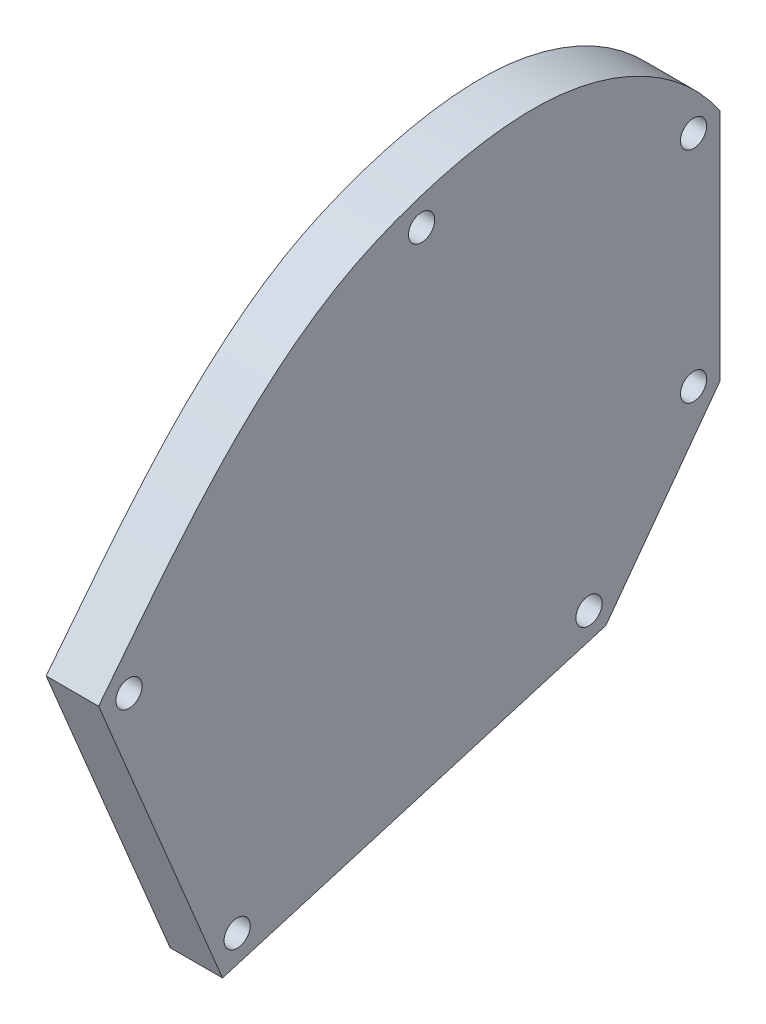
ISO-10303-21;
HEADER;
FILE_DESCRIPTION(('STEP AP214'),'2;1');
FILE_NAME('part.step','',(''),(''),'','','');
FILE_SCHEMA(('AUTOMOTIVE_DESIGN { 1 0 10303 214 1 1 1 1 }'));
ENDSEC;
DATA;
#1=APPLICATION_CONTEXT('core data for automotive mechanical design processes');
#2=APPLICATION_PROTOCOL_DEFINITION('international standard','automotive_design',2000,#1);
#3=PRODUCT_CONTEXT('',#1,'mechanical');
#4=PRODUCT('Part','Part','',(#3));
#5=PRODUCT_RELATED_PRODUCT_CATEGORY('part','',(#4));
#6=PRODUCT_DEFINITION_FORMATION('','',#4);
#7=PRODUCT_DEFINITION_CONTEXT('part definition',#1,'design');
#8=PRODUCT_DEFINITION('design','',#6,#7);
#9=PRODUCT_DEFINITION_SHAPE('','',#8);
#10=(LENGTH_UNIT() NAMED_UNIT(*) SI_UNIT(.MILLI.,.METRE.));
#11=(NAMED_UNIT(*) PLANE_ANGLE_UNIT() SI_UNIT($,.RADIAN.));
#12=(NAMED_UNIT(*) SI_UNIT($,.STERADIAN.) SOLID_ANGLE_UNIT());
#13=UNCERTAINTY_MEASURE_WITH_UNIT(LENGTH_MEASURE(1.E-05),#10,'distance_accuracy_value','');
#14=(GEOMETRIC_REPRESENTATION_CONTEXT(3) GLOBAL_UNCERTAINTY_ASSIGNED_CONTEXT((#13)) GLOBAL_UNIT_ASSIGNED_CONTEXT((#10,
#11,#12)) REPRESENTATION_CONTEXT('',''));
#15=CARTESIAN_POINT('',(0.,0.,0.));
#16=DIRECTION('',(0.,0.,1.));
#17=DIRECTION('',(1.,0.,0.));
#18=AXIS2_PLACEMENT_3D('',#15,#16,#17);
#19=CARTESIAN_POINT('',(5.08,19.6501472675099,-30.0908008453346));
#20=CARTESIAN_POINT('',(5.08,22.7266885493752,-28.0376020757198));
#21=CARTESIAN_POINT('',(5.08,26.8607019031268,-23.0331535864296));
#22=CARTESIAN_POINT('',(5.08,29.0083661189868,-14.9877677231226));
#23=CARTESIAN_POINT('',(5.08,28.7741846644524,-7.52467705502999));
#24=CARTESIAN_POINT('',(5.08,27.0365596662504,-0.603908495868417));
#25=CARTESIAN_POINT('',(5.08,23.8999093453512,6.72773586098099));
#26=CARTESIAN_POINT('',(5.08,19.3751091716336,13.041122451446));
#27=CARTESIAN_POINT('',(5.08,11.3805000333356,21.1985612628424));
#28=CARTESIAN_POINT('',(5.08,4.43101831450736,26.4061007399319));
#29=CARTESIAN_POINT('',(5.08,-0.203985656862166,30.0908008453346));
#30=B_SPLINE_CURVE_WITH_KNOTS('',3,(#19,#20,#21,#22,#23,#24,#25,#26,#27,#28,#29),.UNSPECIFIED.,
.F.,.F.,(4,1,1,1,1,1,1,1,4),(0.,0.148846654175629,0.252987857955237,0.329376305318763,
0.448668946610925,0.539169161480937,0.650373483709234,0.760197294394863,1.),.UNSPECIFIED.);
#31=DIRECTION('',(-1.,0.,0.));
#32=VECTOR('',#31,1.);
#33=SURFACE_OF_LINEAR_EXTRUSION('',#30,#32);
#34=CARTESIAN_POINT('',(0.,19.6501472675099,-30.0908008453346));
#35=CARTESIAN_POINT('',(0.,22.7266885493752,-28.0376020757198));
#36=CARTESIAN_POINT('',(0.,26.8607019031268,-23.0331535864296));
#37=CARTESIAN_POINT('',(0.,29.0083661189868,-14.9877677231226));
#38=CARTESIAN_POINT('',(0.,28.7741846644524,-7.52467705502999));
#39=CARTESIAN_POINT('',(0.,27.0365596662504,-0.603908495868417));
#40=CARTESIAN_POINT('',(0.,23.8999093453512,6.72773586098099));
#41=CARTESIAN_POINT('',(0.,19.3751091716336,13.041122451446));
#42=CARTESIAN_POINT('',(0.,11.3805000333356,21.1985612628424));
#43=CARTESIAN_POINT('',(0.,4.43101831450736,26.4061007399319));
#44=CARTESIAN_POINT('',(0.,-0.203985656862166,30.0908008453346));
#45=B_SPLINE_CURVE_WITH_KNOTS('',3,(#34,#35,#36,#37,#38,#39,#40,#41,#42,#43,#44),.UNSPECIFIED.,
.F.,.F.,(4,1,1,1,1,1,1,1,4),(0.,0.148846654175629,0.252987857955237,0.329376305318763,
0.448668946610925,0.539169161480937,0.650373483709234,0.760197294394863,1.),.UNSPECIFIED.);
#46=CARTESIAN_POINT('',(0.,19.6501472675099,-30.0908008453346));
#47=VERTEX_POINT('',#46);
#48=CARTESIAN_POINT('',(0.,-0.203985656862166,30.0908008453346));
#49=VERTEX_POINT('',#48);
#50=EDGE_CURVE('E121',#47,#49,#45,.T.);
#51=ORIENTED_EDGE('',*,*,#50,.T.);
#52=DIRECTION('',(-1.,0.,0.));
#53=VECTOR('',#52,1.);
#54=CARTESIAN_POINT('',(5.08,-0.203985656862166,30.0908008453346));
#55=LINE('',#54,#53);
#56=CARTESIAN_POINT('',(5.08,-0.203985656862166,30.0908008453346));
#57=VERTEX_POINT('',#56);
#58=EDGE_CURVE('E11',#57,#49,#55,.T.);
#59=ORIENTED_EDGE('',*,*,#58,.F.);
#60=CARTESIAN_POINT('',(5.08,19.6501472675099,-30.0908008453346));
#61=VERTEX_POINT('',#60);
#62=EDGE_CURVE('E139',#61,#57,#30,.T.);
#63=ORIENTED_EDGE('',*,*,#62,.F.);
#64=DIRECTION('',(-1.,0.,0.));
#65=VECTOR('',#64,1.);
#66=CARTESIAN_POINT('',(5.08,19.6501472675099,-30.0908008453346));
#67=LINE('',#66,#65);
#68=EDGE_CURVE('E117',#61,#47,#67,.T.);
#69=ORIENTED_EDGE('',*,*,#68,.T.);
#70=EDGE_LOOP('',(#51,#59,#63,#69));
#71=FACE_BOUND('',#70,.T.);
#72=ADVANCED_FACE('F39',(#71),#33,.F.);
#73=CARTESIAN_POINT('',(5.08,-0.203985656862166,30.0908008453346));
#74=DIRECTION('',(0.,0.384710515007815,-0.923037279660156));
#75=DIRECTION('',(0.,0.923037279660157,0.384710515007815));
#76=AXIS2_PLACEMENT_3D('',#73,#74,#75);
#77=PLANE('',#76);
#78=DIRECTION('',(0.,-0.923037279660156,-0.384710515007815));
#79=VECTOR('',#78,1.);
#80=CARTESIAN_POINT('',(0.,-0.203985656862166,30.0908008453346));
#81=LINE('',#80,#79);
#82=CARTESIAN_POINT('',(0.,-29.0083661189868,18.0854915406607));
#83=VERTEX_POINT('',#82);
#84=EDGE_CURVE('E127',#49,#83,#81,.T.);
#85=ORIENTED_EDGE('',*,*,#84,.T.);
#86=DIRECTION('',(-1.,0.,0.));
#87=VECTOR('',#86,1.);
#88=CARTESIAN_POINT('',(5.08,-29.0083661189868,18.0854915406607));
#89=LINE('',#88,#87);
#90=CARTESIAN_POINT('',(5.08,-29.0083661189868,18.0854915406607));
#91=VERTEX_POINT('',#90);
#92=EDGE_CURVE('E50',#91,#83,#89,.T.);
#93=ORIENTED_EDGE('',*,*,#92,.F.);
#94=DIRECTION('',(0.,-0.923037279660156,-0.384710515007815));
#95=VECTOR('',#94,1.);
#96=CARTESIAN_POINT('',(5.08,-0.203985656862166,30.0908008453346));
#97=LINE('',#96,#95);
#98=EDGE_CURVE('E93',#57,#91,#97,.T.);
#99=ORIENTED_EDGE('',*,*,#98,.F.);
#100=ORIENTED_EDGE('',*,*,#58,.T.);
#101=EDGE_LOOP('',(#85,#93,#99,#100));
#102=FACE_BOUND('',#101,.T.);
#103=ADVANCED_FACE('F203',(#102),#77,.F.);
#104=CARTESIAN_POINT('',(5.08,-29.0083661189868,18.0854915406607));
#105=DIRECTION('',(0.,0.958826474212148,0.283992592068702));
#106=DIRECTION('',(0.,-0.283992592068702,0.958826474212148));
#107=AXIS2_PLACEMENT_3D('',#104,#105,#106);
#108=PLANE('',#107);
#109=DIRECTION('',(0.,0.283992592068702,-0.958826474212149));
#110=VECTOR('',#109,1.);
#111=CARTESIAN_POINT('',(0.,-29.0083661189868,18.0854915406607));
#112=LINE('',#111,#110);
#113=CARTESIAN_POINT('',(0.,-18.0105212011844,-19.0458462511273));
#114=VERTEX_POINT('',#113);
#115=EDGE_CURVE('E109',#83,#114,#112,.T.);
#116=ORIENTED_EDGE('',*,*,#115,.T.);
#117=DIRECTION('',(-1.,0.,0.));
#118=VECTOR('',#117,1.);
#119=CARTESIAN_POINT('',(5.08,-18.0105212011844,-19.0458462511273));
#120=LINE('',#119,#118);
#121=CARTESIAN_POINT('',(5.08,-18.0105212011844,-19.0458462511273));
#122=VERTEX_POINT('',#121);
#123=EDGE_CURVE('E106',#122,#114,#120,.T.);
#124=ORIENTED_EDGE('',*,*,#123,.F.);
#125=DIRECTION('',(0.,0.283992592068702,-0.958826474212149));
#126=VECTOR('',#125,1.);
#127=CARTESIAN_POINT('',(5.08,-29.0083661189868,18.0854915406607));
#128=LINE('',#127,#126);
#129=EDGE_CURVE('E97',#91,#122,#128,.T.);
#130=ORIENTED_EDGE('',*,*,#129,.F.);
#131=ORIENTED_EDGE('',*,*,#92,.T.);
#132=EDGE_LOOP('',(#116,#124,#130,#131));
#133=FACE_BOUND('',#132,.T.);
#134=ADVANCED_FACE('F107',(#133),#108,.F.);
#135=CARTESIAN_POINT('',(5.08,-18.0105212011844,-19.0458462511273));
#136=DIRECTION('',(0.,0.593840213906378,0.804582997799249));
#137=DIRECTION('',(0.,-0.804582997799249,0.593840213906379));
#138=AXIS2_PLACEMENT_3D('',#135,#136,#137);
#139=PLANE('',#138);
#140=DIRECTION('',(0.,0.804582997799249,-0.593840213906379));
#141=VECTOR('',#140,1.);
#142=CARTESIAN_POINT('',(0.,-18.0105212011844,-19.0458462511273));
#143=LINE('',#142,#141);
#144=CARTESIAN_POINT('',(0.,-3.04591882185661,-30.0908008453346));
#145=VERTEX_POINT('',#144);
#146=EDGE_CURVE('E79',#114,#145,#143,.T.);
#147=ORIENTED_EDGE('',*,*,#146,.T.);
#148=DIRECTION('',(-1.,0.,0.));
#149=VECTOR('',#148,1.);
#150=CARTESIAN_POINT('',(5.08,-3.04591882185661,-30.0908008453346));
#151=LINE('',#150,#149);
#152=CARTESIAN_POINT('',(5.08,-3.04591882185661,-30.0908008453346));
#153=VERTEX_POINT('',#152);
#154=EDGE_CURVE('E111',#153,#145,#151,.T.);
#155=ORIENTED_EDGE('',*,*,#154,.F.);
#156=DIRECTION('',(0.,0.804582997799249,-0.593840213906379));
#157=VECTOR('',#156,1.);
#158=CARTESIAN_POINT('',(5.08,-18.0105212011844,-19.0458462511273));
#159=LINE('',#158,#157);
#160=EDGE_CURVE('E101',#122,#153,#159,.T.);
#161=ORIENTED_EDGE('',*,*,#160,.F.);
#162=ORIENTED_EDGE('',*,*,#123,.T.);
#163=EDGE_LOOP('',(#147,#155,#161,#162));
#164=FACE_BOUND('',#163,.T.);
#165=ADVANCED_FACE('F113',(#164),#139,.F.);
#166=CARTESIAN_POINT('',(5.08,-3.04591882185661,-30.0908008453346));
#167=DIRECTION('',(0.,0.,1.));
#168=DIRECTION('',(0.,-1.,0.));
#169=AXIS2_PLACEMENT_3D('',#166,#167,#168);
#170=PLANE('',#169);
#171=DIRECTION('',(0.,1.,0.));
#172=VECTOR('',#171,1.);
#173=CARTESIAN_POINT('',(0.,-3.04591882185661,-30.0908008453346));
#174=LINE('',#173,#172);
#175=EDGE_CURVE('E85',#145,#47,#174,.T.);
#176=ORIENTED_EDGE('',*,*,#175,.T.);
#177=ORIENTED_EDGE('',*,*,#68,.F.);
#178=DIRECTION('',(0.,1.,0.));
#179=VECTOR('',#178,1.);
#180=CARTESIAN_POINT('',(5.08,-3.04591882185661,-30.0908008453346));
#181=LINE('',#180,#179);
#182=EDGE_CURVE('E59',#153,#61,#181,.T.);
#183=ORIENTED_EDGE('',*,*,#182,.F.);
#184=ORIENTED_EDGE('',*,*,#154,.T.);
#185=EDGE_LOOP('',(#176,#177,#183,#184));
#186=FACE_BOUND('',#185,.T.);
#187=ADVANCED_FACE('F192',(#186),#170,.F.);
#188=CARTESIAN_POINT('',(5.08,25.2035290464533,3.54762871232099));
#189=DIRECTION('',(-1.,0.,0.));
#190=DIRECTION('',(0.,0.,1.));
#191=AXIS2_PLACEMENT_3D('',#188,#189,#190);
#192=PLANE('',#191);
#193=CARTESIAN_POINT('',(5.08,-0.589985571487279,27.1490755004191));
#194=DIRECTION('',(1.,0.,0.));
#195=DIRECTION('',(0.,0.,-1.));
#196=AXIS2_PLACEMENT_3D('',#193,#194,#195);
#197=CIRCLE('',#196,1.27);
#198=CARTESIAN_POINT('',(5.08,-0.589985571487279,25.8790755004191));
#199=VERTEX_POINT('',#198);
#200=EDGE_CURVE('E151',#199,#199,#197,.T.);
#201=ORIENTED_EDGE('',*,*,#200,.F.);
#202=EDGE_LOOP('',(#201));
#203=FACE_BOUND('',#202,.T.);
#204=CARTESIAN_POINT('',(5.08,-25.9503372876812,16.665824451473));
#205=DIRECTION('',(1.,0.,0.));
#206=DIRECTION('',(0.,0.,-1.));
#207=AXIS2_PLACEMENT_3D('',#204,#205,#206);
#208=CIRCLE('',#207,1.27);
#209=CARTESIAN_POINT('',(5.08,-25.9503372876812,15.395824451473));
#210=VERTEX_POINT('',#209);
#211=EDGE_CURVE('E296',#210,#210,#208,.T.);
#212=ORIENTED_EDGE('',*,*,#211,.F.);
#213=EDGE_LOOP('',(#212));
#214=FACE_BOUND('',#213,.T.);
#215=CARTESIAN_POINT('',(5.08,-15.9375195635092,-17.4121840359583));
#216=DIRECTION('',(1.,0.,0.));
#217=DIRECTION('',(0.,0.,-1.));
#218=AXIS2_PLACEMENT_3D('',#215,#216,#217);
#219=CIRCLE('',#218,1.27);
#220=CARTESIAN_POINT('',(5.08,-15.9375195635092,-18.6821840359583));
#221=VERTEX_POINT('',#220);
#222=EDGE_CURVE('E299',#221,#221,#219,.T.);
#223=ORIENTED_EDGE('',*,*,#222,.F.);
#224=EDGE_LOOP('',(#223));
#225=FACE_BOUND('',#224,.T.);
#226=CARTESIAN_POINT('',(5.08,-2.20023366428958,-27.544876520459));
#227=DIRECTION('',(1.,0.,0.));
#228=DIRECTION('',(0.,0.,-1.));
#229=AXIS2_PLACEMENT_3D('',#226,#227,#228);
#230=CIRCLE('',#229,1.27);
#231=CARTESIAN_POINT('',(5.08,-2.20023366428958,-28.814876520459));
#232=VERTEX_POINT('',#231);
#233=EDGE_CURVE('E306',#232,#232,#230,.T.);
#234=ORIENTED_EDGE('',*,*,#233,.F.);
#235=EDGE_LOOP('',(#234));
#236=FACE_BOUND('',#235,.T.);
#237=CARTESIAN_POINT('',(5.08,19.0421631314225,-27.544876520459));
#238=DIRECTION('',(1.,0.,0.));
#239=DIRECTION('',(0.,0.,-1.));
#240=AXIS2_PLACEMENT_3D('',#237,#238,#239);
#241=CIRCLE('',#240,1.27);
#242=CARTESIAN_POINT('',(5.08,19.0421631314225,-28.814876520459));
#243=VERTEX_POINT('',#242);
#244=EDGE_CURVE('E312',#243,#243,#241,.T.);
#245=ORIENTED_EDGE('',*,*,#244,.F.);
#246=EDGE_LOOP('',(#245));
#247=FACE_BOUND('',#246,.T.);
#248=CARTESIAN_POINT('',(5.08,24.3198879436576,-1.19866211876336));
#249=DIRECTION('',(1.,0.,0.));
#250=DIRECTION('',(0.,0.,-1.));
#251=AXIS2_PLACEMENT_3D('',#248,#249,#250);
#252=CIRCLE('',#251,1.27);
#253=CARTESIAN_POINT('',(5.08,24.3198879436576,-2.46866211876336));
#254=VERTEX_POINT('',#253);
#255=EDGE_CURVE('E316',#254,#254,#252,.T.);
#256=ORIENTED_EDGE('',*,*,#255,.F.);
#257=EDGE_LOOP('',(#256));
#258=FACE_BOUND('',#257,.T.);
#259=ORIENTED_EDGE('',*,*,#62,.T.);
#260=ORIENTED_EDGE('',*,*,#98,.T.);
#261=ORIENTED_EDGE('',*,*,#129,.T.);
#262=ORIENTED_EDGE('',*,*,#160,.T.);
#263=ORIENTED_EDGE('',*,*,#182,.T.);
#264=EDGE_LOOP('',(#259,#260,#261,#262,#263));
#265=FACE_BOUND('',#264,.T.);
#266=ADVANCED_FACE('F99',(#203,#214,#225,#236,#247,#258,#265),#192,.F.);
#267=CARTESIAN_POINT('',(0.,25.2035290464533,3.54762871232099));
#268=DIRECTION('',(-1.,0.,0.));
#269=DIRECTION('',(0.,0.,1.));
#270=AXIS2_PLACEMENT_3D('',#267,#268,#269);
#271=PLANE('',#270);
#272=CARTESIAN_POINT('',(0.,-0.589985571487279,27.1490755004191));
#273=DIRECTION('',(-1.,0.,0.));
#274=DIRECTION('',(0.,0.,1.));
#275=AXIS2_PLACEMENT_3D('',#272,#273,#274);
#276=CIRCLE('',#275,1.27);
#277=CARTESIAN_POINT('',(0.,-0.589985571487279,28.4190755004191));
#278=VERTEX_POINT('',#277);
#279=EDGE_CURVE('E43',#278,#278,#276,.T.);
#280=ORIENTED_EDGE('',*,*,#279,.F.);
#281=EDGE_LOOP('',(#280));
#282=FACE_BOUND('',#281,.T.);
#283=CARTESIAN_POINT('',(0.,-25.9503372876812,16.665824451473));
#284=DIRECTION('',(-1.,0.,0.));
#285=DIRECTION('',(0.,0.,1.));
#286=AXIS2_PLACEMENT_3D('',#283,#284,#285);
#287=CIRCLE('',#286,1.27);
#288=CARTESIAN_POINT('',(0.,-25.9503372876812,17.935824451473));
#289=VERTEX_POINT('',#288);
#290=EDGE_CURVE('E162',#289,#289,#287,.T.);
#291=ORIENTED_EDGE('',*,*,#290,.F.);
#292=EDGE_LOOP('',(#291));
#293=FACE_BOUND('',#292,.T.);
#294=CARTESIAN_POINT('',(0.,-15.9375195635092,-17.4121840359583));
#295=DIRECTION('',(-1.,0.,0.));
#296=DIRECTION('',(0.,0.,1.));
#297=AXIS2_PLACEMENT_3D('',#294,#295,#296);
#298=CIRCLE('',#297,1.27);
#299=CARTESIAN_POINT('',(0.,-15.9375195635092,-16.1421840359583));
#300=VERTEX_POINT('',#299);
#301=EDGE_CURVE('E159',#300,#300,#298,.T.);
#302=ORIENTED_EDGE('',*,*,#301,.F.);
#303=EDGE_LOOP('',(#302));
#304=FACE_BOUND('',#303,.T.);
#305=CARTESIAN_POINT('',(0.,-2.20023366428958,-27.544876520459));
#306=DIRECTION('',(-1.,0.,0.));
#307=DIRECTION('',(0.,0.,1.));
#308=AXIS2_PLACEMENT_3D('',#305,#306,#307);
#309=CIRCLE('',#308,1.27);
#310=CARTESIAN_POINT('',(0.,-2.20023366428958,-26.274876520459));
#311=VERTEX_POINT('',#310);
#312=EDGE_CURVE('E155',#311,#311,#309,.T.);
#313=ORIENTED_EDGE('',*,*,#312,.F.);
#314=EDGE_LOOP('',(#313));
#315=FACE_BOUND('',#314,.T.);
#316=CARTESIAN_POINT('',(0.,19.0421631314225,-27.544876520459));
#317=DIRECTION('',(-1.,0.,0.));
#318=DIRECTION('',(0.,0.,1.));
#319=AXIS2_PLACEMENT_3D('',#316,#317,#318);
#320=CIRCLE('',#319,1.27);
#321=CARTESIAN_POINT('',(0.,19.0421631314225,-26.274876520459));
#322=VERTEX_POINT('',#321);
#323=EDGE_CURVE('E150',#322,#322,#320,.T.);
#324=ORIENTED_EDGE('',*,*,#323,.F.);
#325=EDGE_LOOP('',(#324));
#326=FACE_BOUND('',#325,.T.);
#327=CARTESIAN_POINT('',(0.,24.3198879436576,-1.19866211876336));
#328=DIRECTION('',(-1.,0.,0.));
#329=DIRECTION('',(0.,0.,1.));
#330=AXIS2_PLACEMENT_3D('',#327,#328,#329);
#331=CIRCLE('',#330,1.27);
#332=CARTESIAN_POINT('',(0.,24.3198879436576,0.071337881236638));
#333=VERTEX_POINT('',#332);
#334=EDGE_CURVE('E146',#333,#333,#331,.T.);
#335=ORIENTED_EDGE('',*,*,#334,.F.);
#336=EDGE_LOOP('',(#335));
#337=FACE_BOUND('',#336,.T.);
#338=ORIENTED_EDGE('',*,*,#50,.F.);
#339=ORIENTED_EDGE('',*,*,#175,.F.);
#340=ORIENTED_EDGE('',*,*,#146,.F.);
#341=ORIENTED_EDGE('',*,*,#115,.F.);
#342=ORIENTED_EDGE('',*,*,#84,.F.);
#343=EDGE_LOOP('',(#338,#339,#340,#341,#342));
#344=FACE_BOUND('',#343,.T.);
#345=ADVANCED_FACE('F174',(#282,#293,#304,#315,#326,#337,#344),#271,.T.);
#346=CARTESIAN_POINT('',(-4.92,24.3198879436576,-1.19866211876336));
#347=DIRECTION('',(1.,0.,0.));
#348=DIRECTION('',(0.,0.,-1.));
#349=AXIS2_PLACEMENT_3D('',#346,#347,#348);
#350=CYLINDRICAL_SURFACE('',#349,1.27);
#351=ORIENTED_EDGE('',*,*,#334,.T.);
#352=EDGE_LOOP('',(#351));
#353=FACE_BOUND('',#352,.T.);
#354=ORIENTED_EDGE('',*,*,#255,.T.);
#355=EDGE_LOOP('',(#354));
#356=FACE_BOUND('',#355,.T.);
#357=ADVANCED_FACE('F177',(#353,#356),#350,.F.);
#358=CARTESIAN_POINT('',(-4.92,19.0421631314225,-27.544876520459));
#359=DIRECTION('',(1.,0.,0.));
#360=DIRECTION('',(0.,0.,-1.));
#361=AXIS2_PLACEMENT_3D('',#358,#359,#360);
#362=CYLINDRICAL_SURFACE('',#361,1.27);
#363=ORIENTED_EDGE('',*,*,#323,.T.);
#364=EDGE_LOOP('',(#363));
#365=FACE_BOUND('',#364,.T.);
#366=ORIENTED_EDGE('',*,*,#244,.T.);
#367=EDGE_LOOP('',(#366));
#368=FACE_BOUND('',#367,.T.);
#369=ADVANCED_FACE('F242',(#365,#368),#362,.F.);
#370=CARTESIAN_POINT('',(-4.92,-2.20023366428958,-27.544876520459));
#371=DIRECTION('',(1.,0.,0.));
#372=DIRECTION('',(0.,0.,-1.));
#373=AXIS2_PLACEMENT_3D('',#370,#371,#372);
#374=CYLINDRICAL_SURFACE('',#373,1.27);
#375=ORIENTED_EDGE('',*,*,#312,.T.);
#376=EDGE_LOOP('',(#375));
#377=FACE_BOUND('',#376,.T.);
#378=ORIENTED_EDGE('',*,*,#233,.T.);
#379=EDGE_LOOP('',(#378));
#380=FACE_BOUND('',#379,.T.);
#381=ADVANCED_FACE('F252',(#377,#380),#374,.F.);
#382=CARTESIAN_POINT('',(-4.92,-15.9375195635092,-17.4121840359583));
#383=DIRECTION('',(1.,0.,0.));
#384=DIRECTION('',(0.,0.,-1.));
#385=AXIS2_PLACEMENT_3D('',#382,#383,#384);
#386=CYLINDRICAL_SURFACE('',#385,1.27);
#387=ORIENTED_EDGE('',*,*,#301,.T.);
#388=EDGE_LOOP('',(#387));
#389=FACE_BOUND('',#388,.T.);
#390=ORIENTED_EDGE('',*,*,#222,.T.);
#391=EDGE_LOOP('',(#390));
#392=FACE_BOUND('',#391,.T.);
#393=ADVANCED_FACE('F262',(#389,#392),#386,.F.);
#394=CARTESIAN_POINT('',(-4.92,-25.9503372876812,16.665824451473));
#395=DIRECTION('',(1.,0.,0.));
#396=DIRECTION('',(0.,0.,-1.));
#397=AXIS2_PLACEMENT_3D('',#394,#395,#396);
#398=CYLINDRICAL_SURFACE('',#397,1.27);
#399=ORIENTED_EDGE('',*,*,#290,.T.);
#400=EDGE_LOOP('',(#399));
#401=FACE_BOUND('',#400,.T.);
#402=ORIENTED_EDGE('',*,*,#211,.T.);
#403=EDGE_LOOP('',(#402));
#404=FACE_BOUND('',#403,.T.);
#405=ADVANCED_FACE('F272',(#401,#404),#398,.F.);
#406=CARTESIAN_POINT('',(-4.92,-0.589985571487279,27.1490755004191));
#407=DIRECTION('',(1.,0.,0.));
#408=DIRECTION('',(0.,0.,-1.));
#409=AXIS2_PLACEMENT_3D('',#406,#407,#408);
#410=CYLINDRICAL_SURFACE('',#409,1.27);
#411=ORIENTED_EDGE('',*,*,#279,.T.);
#412=EDGE_LOOP('',(#411));
#413=FACE_BOUND('',#412,.T.);
#414=ORIENTED_EDGE('',*,*,#200,.T.);
#415=EDGE_LOOP('',(#414));
#416=FACE_BOUND('',#415,.T.);
#417=ADVANCED_FACE('F171',(#413,#416),#410,.F.);
#418=CLOSED_SHELL('',(#72,#103,#134,#165,#187,#266,#345,#357,#369,#381,#393,#405,#417));
#419=MANIFOLD_SOLID_BREP('B2',#418);
#420=ADVANCED_BREP_SHAPE_REPRESENTATION('',(#18,#419),#14);
#421=SHAPE_DEFINITION_REPRESENTATION(#9,#420);
ENDSEC;
END-ISO-10303-21;
